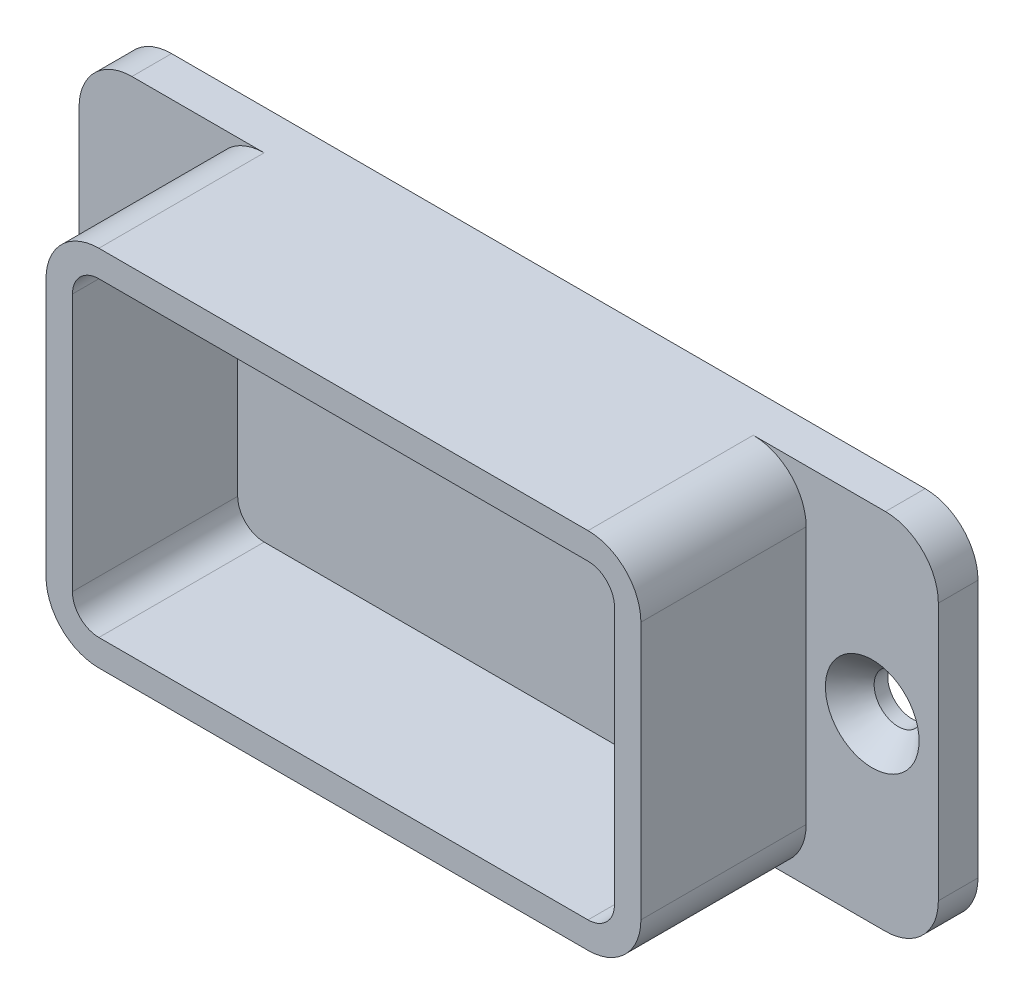
ISO-10303-21;
HEADER;
FILE_DESCRIPTION(('STEP AP214'),'2;1');
FILE_NAME('part.step','',(''),(''),'','','');
FILE_SCHEMA(('AUTOMOTIVE_DESIGN { 1 0 10303 214 1 1 1 1 }'));
ENDSEC;
DATA;
#1=APPLICATION_CONTEXT('core data for automotive mechanical design processes');
#2=APPLICATION_PROTOCOL_DEFINITION('international standard','automotive_design',2000,#1);
#3=PRODUCT_CONTEXT('',#1,'mechanical');
#4=PRODUCT('Part','Part','',(#3));
#5=PRODUCT_RELATED_PRODUCT_CATEGORY('part','',(#4));
#6=PRODUCT_DEFINITION_FORMATION('','',#4);
#7=PRODUCT_DEFINITION_CONTEXT('part definition',#1,'design');
#8=PRODUCT_DEFINITION('design','',#6,#7);
#9=PRODUCT_DEFINITION_SHAPE('','',#8);
#10=(LENGTH_UNIT() NAMED_UNIT(*) SI_UNIT(.MILLI.,.METRE.));
#11=(NAMED_UNIT(*) PLANE_ANGLE_UNIT() SI_UNIT($,.RADIAN.));
#12=(NAMED_UNIT(*) SI_UNIT($,.STERADIAN.) SOLID_ANGLE_UNIT());
#13=UNCERTAINTY_MEASURE_WITH_UNIT(LENGTH_MEASURE(1.E-05),#10,'distance_accuracy_value','');
#14=(GEOMETRIC_REPRESENTATION_CONTEXT(3) GLOBAL_UNCERTAINTY_ASSIGNED_CONTEXT((#13)) GLOBAL_UNIT_ASSIGNED_CONTEXT((#10,
#11,#12)) REPRESENTATION_CONTEXT('',''));
#15=CARTESIAN_POINT('',(0.,0.,0.));
#16=DIRECTION('',(0.,0.,1.));
#17=DIRECTION('',(1.,0.,0.));
#18=AXIS2_PLACEMENT_3D('',#15,#16,#17);
#19=CARTESIAN_POINT('',(-22.5,-13.75,65.7375577743225));
#20=DIRECTION('',(0.,1.,0.));
#21=DIRECTION('',(0.,0.,1.));
#22=AXIS2_PLACEMENT_3D('',#19,#20,#21);
#23=PLANE('',#22);
#24=DIRECTION('',(1.,0.,0.));
#25=VECTOR('',#24,1.);
#26=CARTESIAN_POINT('',(-32.5,-13.75,0.5));
#27=LINE('',#26,#25);
#28=CARTESIAN_POINT('',(18.5,-13.75,0.5));
#29=VERTEX_POINT('',#28);
#30=CARTESIAN_POINT('',(28.5,-13.75,0.5));
#31=VERTEX_POINT('',#30);
#32=EDGE_CURVE('E50',#29,#31,#27,.T.);
#33=ORIENTED_EDGE('',*,*,#32,.F.);
#34=DIRECTION('',(0.,0.,-1.));
#35=VECTOR('',#34,1.);
#36=CARTESIAN_POINT('',(18.5,-13.75,65.7375577743225));
#37=LINE('',#36,#35);
#38=CARTESIAN_POINT('',(18.5,-13.75,13.));
#39=VERTEX_POINT('',#38);
#40=EDGE_CURVE('E315',#29,#39,#37,.F.);
#41=ORIENTED_EDGE('',*,*,#40,.T.);
#42=DIRECTION('',(1.,0.,0.));
#43=VECTOR('',#42,1.);
#44=CARTESIAN_POINT('',(-22.5,-13.75,13.));
#45=LINE('',#44,#43);
#46=CARTESIAN_POINT('',(-18.5,-13.75,13.));
#47=VERTEX_POINT('',#46);
#48=EDGE_CURVE('E332',#47,#39,#45,.T.);
#49=ORIENTED_EDGE('',*,*,#48,.F.);
#50=DIRECTION('',(0.,0.,-1.));
#51=VECTOR('',#50,1.);
#52=CARTESIAN_POINT('',(-18.5,-13.75,65.7375577743225));
#53=LINE('',#52,#51);
#54=CARTESIAN_POINT('',(-18.5,-13.75,0.5));
#55=VERTEX_POINT('',#54);
#56=EDGE_CURVE('E312',#47,#55,#53,.T.);
#57=ORIENTED_EDGE('',*,*,#56,.T.);
#58=CARTESIAN_POINT('',(-28.5,-13.75,0.5));
#59=VERTEX_POINT('',#58);
#60=EDGE_CURVE('E57',#59,#55,#27,.T.);
#61=ORIENTED_EDGE('',*,*,#60,.F.);
#62=DIRECTION('',(0.,0.,-1.));
#63=VECTOR('',#62,1.);
#64=CARTESIAN_POINT('',(-28.5,-13.75,65.7375577743225));
#65=LINE('',#64,#63);
#66=CARTESIAN_POINT('',(-28.5,-13.75,-2.5));
#67=VERTEX_POINT('',#66);
#68=EDGE_CURVE('E205',#59,#67,#65,.T.);
#69=ORIENTED_EDGE('',*,*,#68,.T.);
#70=DIRECTION('',(1.,0.,0.));
#71=VECTOR('',#70,1.);
#72=CARTESIAN_POINT('',(-22.5,-13.75,-2.5));
#73=LINE('',#72,#71);
#74=CARTESIAN_POINT('',(28.5,-13.75,-2.5));
#75=VERTEX_POINT('',#74);
#76=EDGE_CURVE('E356',#67,#75,#73,.T.);
#77=ORIENTED_EDGE('',*,*,#76,.T.);
#78=DIRECTION('',(0.,0.,-1.));
#79=VECTOR('',#78,1.);
#80=CARTESIAN_POINT('',(28.5,-13.75,65.7375577743225));
#81=LINE('',#80,#79);
#82=EDGE_CURVE('E244',#75,#31,#81,.F.);
#83=ORIENTED_EDGE('',*,*,#82,.T.);
#84=EDGE_LOOP('',(#33,#41,#49,#57,#61,#69,#77,#83));
#85=FACE_BOUND('',#84,.T.);
#86=ADVANCED_FACE('F35',(#85),#23,.F.);
#87=CARTESIAN_POINT('',(-22.5,-13.75,65.7375577743225));
#88=DIRECTION('',(1.,0.,0.));
#89=DIRECTION('',(0.,0.,-1.));
#90=AXIS2_PLACEMENT_3D('',#87,#88,#89);
#91=PLANE('',#90);
#92=DIRECTION('',(0.,-1.,0.));
#93=VECTOR('',#92,1.);
#94=CARTESIAN_POINT('',(-22.5,-13.75,13.));
#95=LINE('',#94,#93);
#96=CARTESIAN_POINT('',(-22.5,9.75,13.));
#97=VERTEX_POINT('',#96);
#98=CARTESIAN_POINT('',(-22.5,-9.75,13.));
#99=VERTEX_POINT('',#98);
#100=EDGE_CURVE('E341',#97,#99,#95,.T.);
#101=ORIENTED_EDGE('',*,*,#100,.F.);
#102=DIRECTION('',(0.,0.,-1.));
#103=VECTOR('',#102,1.);
#104=CARTESIAN_POINT('',(-22.5,9.75,65.7375577743225));
#105=LINE('',#104,#103);
#106=CARTESIAN_POINT('',(-22.5,9.75,0.5));
#107=VERTEX_POINT('',#106);
#108=EDGE_CURVE('E293',#97,#107,#105,.T.);
#109=ORIENTED_EDGE('',*,*,#108,.T.);
#110=DIRECTION('',(0.,-1.,0.));
#111=VECTOR('',#110,1.);
#112=CARTESIAN_POINT('',(-22.5,-13.75,0.5));
#113=LINE('',#112,#111);
#114=CARTESIAN_POINT('',(-22.5,-9.75,0.5));
#115=VERTEX_POINT('',#114);
#116=EDGE_CURVE('E397',#107,#115,#113,.T.);
#117=ORIENTED_EDGE('',*,*,#116,.T.);
#118=DIRECTION('',(0.,0.,-1.));
#119=VECTOR('',#118,1.);
#120=CARTESIAN_POINT('',(-22.5,-9.75,65.7375577743225));
#121=LINE('',#120,#119);
#122=EDGE_CURVE('E291',#115,#99,#121,.F.);
#123=ORIENTED_EDGE('',*,*,#122,.T.);
#124=EDGE_LOOP('',(#101,#109,#117,#123));
#125=FACE_BOUND('',#124,.T.);
#126=ADVANCED_FACE('F468',(#125),#91,.F.);
#127=CARTESIAN_POINT('',(-22.5,13.75,65.7375577743225));
#128=DIRECTION('',(0.,-1.,0.));
#129=DIRECTION('',(0.,0.,-1.));
#130=AXIS2_PLACEMENT_3D('',#127,#128,#129);
#131=PLANE('',#130);
#132=DIRECTION('',(-1.,0.,0.));
#133=VECTOR('',#132,1.);
#134=CARTESIAN_POINT('',(-32.5,13.75,0.5));
#135=LINE('',#134,#133);
#136=CARTESIAN_POINT('',(-18.5,13.75,0.5));
#137=VERTEX_POINT('',#136);
#138=CARTESIAN_POINT('',(-28.5,13.75,0.5));
#139=VERTEX_POINT('',#138);
#140=EDGE_CURVE('E219',#137,#139,#135,.T.);
#141=ORIENTED_EDGE('',*,*,#140,.F.);
#142=DIRECTION('',(0.,0.,-1.));
#143=VECTOR('',#142,1.);
#144=CARTESIAN_POINT('',(-18.5,13.75,65.7375577743225));
#145=LINE('',#144,#143);
#146=CARTESIAN_POINT('',(-18.5,13.75,13.));
#147=VERTEX_POINT('',#146);
#148=EDGE_CURVE('E297',#137,#147,#145,.F.);
#149=ORIENTED_EDGE('',*,*,#148,.T.);
#150=DIRECTION('',(-1.,0.,0.));
#151=VECTOR('',#150,1.);
#152=CARTESIAN_POINT('',(-22.5,13.75,13.));
#153=LINE('',#152,#151);
#154=CARTESIAN_POINT('',(18.5,13.75,13.));
#155=VERTEX_POINT('',#154);
#156=EDGE_CURVE('E344',#155,#147,#153,.T.);
#157=ORIENTED_EDGE('',*,*,#156,.F.);
#158=DIRECTION('',(0.,0.,-1.));
#159=VECTOR('',#158,1.);
#160=CARTESIAN_POINT('',(18.5,13.75,65.7375577743225));
#161=LINE('',#160,#159);
#162=CARTESIAN_POINT('',(18.5,13.75,0.5));
#163=VERTEX_POINT('',#162);
#164=EDGE_CURVE('E217',#155,#163,#161,.T.);
#165=ORIENTED_EDGE('',*,*,#164,.T.);
#166=CARTESIAN_POINT('',(28.5,13.75,0.5));
#167=VERTEX_POINT('',#166);
#168=EDGE_CURVE('E198',#167,#163,#135,.T.);
#169=ORIENTED_EDGE('',*,*,#168,.F.);
#170=DIRECTION('',(0.,0.,-1.));
#171=VECTOR('',#170,1.);
#172=CARTESIAN_POINT('',(28.5,13.75,65.7375577743225));
#173=LINE('',#172,#171);
#174=CARTESIAN_POINT('',(28.5,13.75,-2.5));
#175=VERTEX_POINT('',#174);
#176=EDGE_CURVE('E213',#167,#175,#173,.T.);
#177=ORIENTED_EDGE('',*,*,#176,.T.);
#178=DIRECTION('',(-1.,0.,0.));
#179=VECTOR('',#178,1.);
#180=CARTESIAN_POINT('',(-22.5,13.75,-2.5));
#181=LINE('',#180,#179);
#182=CARTESIAN_POINT('',(-28.5,13.75,-2.5));
#183=VERTEX_POINT('',#182);
#184=EDGE_CURVE('E354',#175,#183,#181,.T.);
#185=ORIENTED_EDGE('',*,*,#184,.T.);
#186=DIRECTION('',(0.,0.,-1.));
#187=VECTOR('',#186,1.);
#188=CARTESIAN_POINT('',(-28.5,13.75,65.7375577743225));
#189=LINE('',#188,#187);
#190=EDGE_CURVE('E224',#183,#139,#189,.F.);
#191=ORIENTED_EDGE('',*,*,#190,.T.);
#192=EDGE_LOOP('',(#141,#149,#157,#165,#169,#177,#185,#191));
#193=FACE_BOUND('',#192,.T.);
#194=ADVANCED_FACE('F211',(#193),#131,.F.);
#195=CARTESIAN_POINT('',(22.5,-13.75,65.7375577743225));
#196=DIRECTION('',(-1.,0.,0.));
#197=DIRECTION('',(0.,0.,1.));
#198=AXIS2_PLACEMENT_3D('',#195,#196,#197);
#199=PLANE('',#198);
#200=DIRECTION('',(0.,1.,0.));
#201=VECTOR('',#200,1.);
#202=CARTESIAN_POINT('',(22.5,-13.75,0.5));
#203=LINE('',#202,#201);
#204=CARTESIAN_POINT('',(22.5,-9.75,0.5));
#205=VERTEX_POINT('',#204);
#206=CARTESIAN_POINT('',(22.5,9.75,0.5));
#207=VERTEX_POINT('',#206);
#208=EDGE_CURVE('E325',#205,#207,#203,.T.);
#209=ORIENTED_EDGE('',*,*,#208,.T.);
#210=DIRECTION('',(0.,0.,-1.));
#211=VECTOR('',#210,1.);
#212=CARTESIAN_POINT('',(22.5,9.75,65.7375577743225));
#213=LINE('',#212,#211);
#214=CARTESIAN_POINT('',(22.5,9.75,13.));
#215=VERTEX_POINT('',#214);
#216=EDGE_CURVE('E310',#207,#215,#213,.F.);
#217=ORIENTED_EDGE('',*,*,#216,.T.);
#218=DIRECTION('',(0.,1.,0.));
#219=VECTOR('',#218,1.);
#220=CARTESIAN_POINT('',(22.5,-13.75,13.));
#221=LINE('',#220,#219);
#222=CARTESIAN_POINT('',(22.5,-9.75,13.));
#223=VERTEX_POINT('',#222);
#224=EDGE_CURVE('E352',#223,#215,#221,.T.);
#225=ORIENTED_EDGE('',*,*,#224,.F.);
#226=DIRECTION('',(0.,0.,-1.));
#227=VECTOR('',#226,1.);
#228=CARTESIAN_POINT('',(22.5,-9.75,65.7375577743225));
#229=LINE('',#228,#227);
#230=EDGE_CURVE('E307',#223,#205,#229,.T.);
#231=ORIENTED_EDGE('',*,*,#230,.T.);
#232=EDGE_LOOP('',(#209,#217,#225,#231));
#233=FACE_BOUND('',#232,.T.);
#234=ADVANCED_FACE('F478',(#233),#199,.F.);
#235=CARTESIAN_POINT('',(0.,0.,-2.5));
#236=DIRECTION('',(0.,0.,-1.));
#237=DIRECTION('',(-1.,0.,0.));
#238=AXIS2_PLACEMENT_3D('',#235,#236,#237);
#239=PLANE('',#238);
#240=CARTESIAN_POINT('',(-27.5,0.,-2.5));
#241=DIRECTION('',(0.,0.,1.));
#242=DIRECTION('',(1.,0.,0.));
#243=AXIS2_PLACEMENT_3D('',#240,#241,#242);
#244=CIRCLE('',#243,1.8288);
#245=CARTESIAN_POINT('',(-25.6712,0.,-2.5));
#246=VERTEX_POINT('',#245);
#247=EDGE_CURVE('E428',#246,#246,#244,.T.);
#248=ORIENTED_EDGE('',*,*,#247,.T.);
#249=EDGE_LOOP('',(#248));
#250=FACE_BOUND('',#249,.T.);
#251=CARTESIAN_POINT('',(27.5,0.,-2.5));
#252=DIRECTION('',(0.,0.,1.));
#253=DIRECTION('',(1.,0.,0.));
#254=AXIS2_PLACEMENT_3D('',#251,#252,#253);
#255=CIRCLE('',#254,1.8288);
#256=CARTESIAN_POINT('',(29.3288,0.,-2.5));
#257=VERTEX_POINT('',#256);
#258=EDGE_CURVE('E414',#257,#257,#255,.T.);
#259=ORIENTED_EDGE('',*,*,#258,.T.);
#260=EDGE_LOOP('',(#259));
#261=FACE_BOUND('',#260,.T.);
#262=ORIENTED_EDGE('',*,*,#184,.F.);
#263=CARTESIAN_POINT('',(28.5,9.75,-2.5));
#264=DIRECTION('',(0.,0.,-1.));
#265=DIRECTION('',(-1.,0.,0.));
#266=AXIS2_PLACEMENT_3D('',#263,#264,#265);
#267=CIRCLE('',#266,4.);
#268=CARTESIAN_POINT('',(32.5,9.75,-2.5));
#269=VERTEX_POINT('',#268);
#270=EDGE_CURVE('E222',#175,#269,#267,.T.);
#271=ORIENTED_EDGE('',*,*,#270,.T.);
#272=DIRECTION('',(0.,1.,0.));
#273=VECTOR('',#272,1.);
#274=CARTESIAN_POINT('',(32.5,13.75,-2.5));
#275=LINE('',#274,#273);
#276=CARTESIAN_POINT('',(32.5,-9.75,-2.5));
#277=VERTEX_POINT('',#276);
#278=EDGE_CURVE('E408',#277,#269,#275,.T.);
#279=ORIENTED_EDGE('',*,*,#278,.F.);
#280=CARTESIAN_POINT('',(28.5,-9.75,-2.5));
#281=DIRECTION('',(0.,0.,-1.));
#282=DIRECTION('',(-1.,0.,0.));
#283=AXIS2_PLACEMENT_3D('',#280,#281,#282);
#284=CIRCLE('',#283,4.);
#285=EDGE_CURVE('E233',#277,#75,#284,.T.);
#286=ORIENTED_EDGE('',*,*,#285,.T.);
#287=ORIENTED_EDGE('',*,*,#76,.F.);
#288=CARTESIAN_POINT('',(-28.5,-9.75,-2.5));
#289=DIRECTION('',(0.,0.,-1.));
#290=DIRECTION('',(-1.,0.,0.));
#291=AXIS2_PLACEMENT_3D('',#288,#289,#290);
#292=CIRCLE('',#291,4.);
#293=CARTESIAN_POINT('',(-32.5,-9.75,-2.5));
#294=VERTEX_POINT('',#293);
#295=EDGE_CURVE('E223',#67,#294,#292,.T.);
#296=ORIENTED_EDGE('',*,*,#295,.T.);
#297=DIRECTION('',(0.,-1.,0.));
#298=VECTOR('',#297,1.);
#299=CARTESIAN_POINT('',(-32.5,13.75,-2.5));
#300=LINE('',#299,#298);
#301=CARTESIAN_POINT('',(-32.5,9.75,-2.5));
#302=VERTEX_POINT('',#301);
#303=EDGE_CURVE('E412',#302,#294,#300,.T.);
#304=ORIENTED_EDGE('',*,*,#303,.F.);
#305=CARTESIAN_POINT('',(-28.5,9.75,-2.5));
#306=DIRECTION('',(0.,0.,-1.));
#307=DIRECTION('',(-1.,0.,0.));
#308=AXIS2_PLACEMENT_3D('',#305,#306,#307);
#309=CIRCLE('',#308,4.);
#310=EDGE_CURVE('E226',#302,#183,#309,.T.);
#311=ORIENTED_EDGE('',*,*,#310,.T.);
#312=EDGE_LOOP('',(#262,#271,#279,#286,#287,#296,#304,#311));
#313=FACE_BOUND('',#312,.T.);
#314=ADVANCED_FACE('F457',(#250,#261,#313),#239,.T.);
#315=CARTESIAN_POINT('',(-20.5,-11.75,65.7375577743225));
#316=DIRECTION('',(0.,1.,0.));
#317=DIRECTION('',(0.,0.,1.));
#318=AXIS2_PLACEMENT_3D('',#315,#316,#317);
#319=PLANE('',#318);
#320=DIRECTION('',(1.,0.,0.));
#321=VECTOR('',#320,1.);
#322=CARTESIAN_POINT('',(-20.5,-11.75,0.5));
#323=LINE('',#322,#321);
#324=CARTESIAN_POINT('',(-18.5,-11.75,0.5));
#325=VERTEX_POINT('',#324);
#326=CARTESIAN_POINT('',(18.5,-11.75,0.5));
#327=VERTEX_POINT('',#326);
#328=EDGE_CURVE('E385',#325,#327,#323,.T.);
#329=ORIENTED_EDGE('',*,*,#328,.F.);
#330=DIRECTION('',(0.,0.,-1.));
#331=VECTOR('',#330,1.);
#332=CARTESIAN_POINT('',(-18.5,-11.75,13.));
#333=LINE('',#332,#331);
#334=CARTESIAN_POINT('',(-18.5,-11.75,13.));
#335=VERTEX_POINT('',#334);
#336=EDGE_CURVE('E271',#325,#335,#333,.F.);
#337=ORIENTED_EDGE('',*,*,#336,.T.);
#338=DIRECTION('',(1.,0.,0.));
#339=VECTOR('',#338,1.);
#340=CARTESIAN_POINT('',(-20.5,-11.75,13.));
#341=LINE('',#340,#339);
#342=CARTESIAN_POINT('',(18.5,-11.75,13.));
#343=VERTEX_POINT('',#342);
#344=EDGE_CURVE('E359',#335,#343,#341,.T.);
#345=ORIENTED_EDGE('',*,*,#344,.T.);
#346=DIRECTION('',(0.,0.,-1.));
#347=VECTOR('',#346,1.);
#348=CARTESIAN_POINT('',(18.5,-11.75,0.5));
#349=LINE('',#348,#347);
#350=EDGE_CURVE('E268',#343,#327,#349,.T.);
#351=ORIENTED_EDGE('',*,*,#350,.T.);
#352=EDGE_LOOP('',(#329,#337,#345,#351));
#353=FACE_BOUND('',#352,.T.);
#354=ADVANCED_FACE('F383',(#353),#319,.T.);
#355=CARTESIAN_POINT('',(-20.5,-11.75,65.7375577743225));
#356=DIRECTION('',(1.,0.,0.));
#357=DIRECTION('',(0.,0.,-1.));
#358=AXIS2_PLACEMENT_3D('',#355,#356,#357);
#359=PLANE('',#358);
#360=DIRECTION('',(0.,-1.,0.));
#361=VECTOR('',#360,1.);
#362=CARTESIAN_POINT('',(-20.5,-11.75,13.));
#363=LINE('',#362,#361);
#364=CARTESIAN_POINT('',(-20.5,9.75,13.));
#365=VERTEX_POINT('',#364);
#366=CARTESIAN_POINT('',(-20.5,-9.75,13.));
#367=VERTEX_POINT('',#366);
#368=EDGE_CURVE('E391',#365,#367,#363,.T.);
#369=ORIENTED_EDGE('',*,*,#368,.T.);
#370=DIRECTION('',(0.,0.,-1.));
#371=VECTOR('',#370,1.);
#372=CARTESIAN_POINT('',(-20.5,-9.75,0.5));
#373=LINE('',#372,#371);
#374=CARTESIAN_POINT('',(-20.5,-9.75,0.5));
#375=VERTEX_POINT('',#374);
#376=EDGE_CURVE('E257',#367,#375,#373,.T.);
#377=ORIENTED_EDGE('',*,*,#376,.T.);
#378=DIRECTION('',(0.,-1.,0.));
#379=VECTOR('',#378,1.);
#380=CARTESIAN_POINT('',(-20.5,-11.75,0.5));
#381=LINE('',#380,#379);
#382=CARTESIAN_POINT('',(-20.5,9.75,0.5));
#383=VERTEX_POINT('',#382);
#384=EDGE_CURVE('E405',#383,#375,#381,.T.);
#385=ORIENTED_EDGE('',*,*,#384,.F.);
#386=DIRECTION('',(0.,0.,-1.));
#387=VECTOR('',#386,1.);
#388=CARTESIAN_POINT('',(-20.5,9.75,13.));
#389=LINE('',#388,#387);
#390=EDGE_CURVE('E255',#383,#365,#389,.F.);
#391=ORIENTED_EDGE('',*,*,#390,.T.);
#392=EDGE_LOOP('',(#369,#377,#385,#391));
#393=FACE_BOUND('',#392,.T.);
#394=ADVANCED_FACE('F394',(#393),#359,.T.);
#395=CARTESIAN_POINT('',(-20.5,11.75,65.7375577743225));
#396=DIRECTION('',(0.,-1.,0.));
#397=DIRECTION('',(0.,0.,-1.));
#398=AXIS2_PLACEMENT_3D('',#395,#396,#397);
#399=PLANE('',#398);
#400=DIRECTION('',(-1.,0.,0.));
#401=VECTOR('',#400,1.);
#402=CARTESIAN_POINT('',(-20.5,11.75,0.5));
#403=LINE('',#402,#401);
#404=CARTESIAN_POINT('',(18.5,11.75,0.5));
#405=VERTEX_POINT('',#404);
#406=CARTESIAN_POINT('',(-18.5,11.75,0.5));
#407=VERTEX_POINT('',#406);
#408=EDGE_CURVE('E218',#405,#407,#403,.T.);
#409=ORIENTED_EDGE('',*,*,#408,.F.);
#410=DIRECTION('',(0.,0.,-1.));
#411=VECTOR('',#410,1.);
#412=CARTESIAN_POINT('',(18.5,11.75,13.));
#413=LINE('',#412,#411);
#414=CARTESIAN_POINT('',(18.5,11.75,13.));
#415=VERTEX_POINT('',#414);
#416=EDGE_CURVE('E281',#405,#415,#413,.F.);
#417=ORIENTED_EDGE('',*,*,#416,.T.);
#418=DIRECTION('',(-1.,0.,0.));
#419=VECTOR('',#418,1.);
#420=CARTESIAN_POINT('',(-20.5,11.75,13.));
#421=LINE('',#420,#419);
#422=CARTESIAN_POINT('',(-18.5,11.75,13.));
#423=VERTEX_POINT('',#422);
#424=EDGE_CURVE('E347',#415,#423,#421,.T.);
#425=ORIENTED_EDGE('',*,*,#424,.T.);
#426=DIRECTION('',(0.,0.,-1.));
#427=VECTOR('',#426,1.);
#428=CARTESIAN_POINT('',(-18.5,11.75,0.5));
#429=LINE('',#428,#427);
#430=EDGE_CURVE('E278',#423,#407,#429,.T.);
#431=ORIENTED_EDGE('',*,*,#430,.T.);
#432=EDGE_LOOP('',(#409,#417,#425,#431));
#433=FACE_BOUND('',#432,.T.);
#434=ADVANCED_FACE('F498',(#433),#399,.T.);
#435=CARTESIAN_POINT('',(20.5,-11.75,65.7375577743225));
#436=DIRECTION('',(-1.,0.,0.));
#437=DIRECTION('',(0.,0.,1.));
#438=AXIS2_PLACEMENT_3D('',#435,#436,#437);
#439=PLANE('',#438);
#440=DIRECTION('',(0.,1.,0.));
#441=VECTOR('',#440,1.);
#442=CARTESIAN_POINT('',(20.5,-11.75,0.5));
#443=LINE('',#442,#441);
#444=CARTESIAN_POINT('',(20.5,-9.75,0.5));
#445=VERTEX_POINT('',#444);
#446=CARTESIAN_POINT('',(20.5,9.75,0.5));
#447=VERTEX_POINT('',#446);
#448=EDGE_CURVE('E228',#445,#447,#443,.T.);
#449=ORIENTED_EDGE('',*,*,#448,.F.);
#450=DIRECTION('',(0.,0.,-1.));
#451=VECTOR('',#450,1.);
#452=CARTESIAN_POINT('',(20.5,-9.75,13.));
#453=LINE('',#452,#451);
#454=CARTESIAN_POINT('',(20.5,-9.75,13.));
#455=VERTEX_POINT('',#454);
#456=EDGE_CURVE('E276',#445,#455,#453,.F.);
#457=ORIENTED_EDGE('',*,*,#456,.T.);
#458=DIRECTION('',(0.,1.,0.));
#459=VECTOR('',#458,1.);
#460=CARTESIAN_POINT('',(20.5,-11.75,13.));
#461=LINE('',#460,#459);
#462=CARTESIAN_POINT('',(20.5,9.75,13.));
#463=VERTEX_POINT('',#462);
#464=EDGE_CURVE('E342',#455,#463,#461,.T.);
#465=ORIENTED_EDGE('',*,*,#464,.T.);
#466=DIRECTION('',(0.,0.,-1.));
#467=VECTOR('',#466,1.);
#468=CARTESIAN_POINT('',(20.5,9.75,0.5));
#469=LINE('',#468,#467);
#470=EDGE_CURVE('E273',#463,#447,#469,.T.);
#471=ORIENTED_EDGE('',*,*,#470,.T.);
#472=EDGE_LOOP('',(#449,#457,#465,#471));
#473=FACE_BOUND('',#472,.T.);
#474=ADVANCED_FACE('F371',(#473),#439,.T.);
#475=CARTESIAN_POINT('',(0.,0.,13.));
#476=DIRECTION('',(0.,0.,1.));
#477=DIRECTION('',(1.,0.,0.));
#478=AXIS2_PLACEMENT_3D('',#475,#476,#477);
#479=PLANE('',#478);
#480=ORIENTED_EDGE('',*,*,#464,.F.);
#481=CARTESIAN_POINT('',(18.5,-9.75,13.));
#482=DIRECTION('',(0.,0.,1.));
#483=DIRECTION('',(1.,0.,0.));
#484=AXIS2_PLACEMENT_3D('',#481,#482,#483);
#485=CIRCLE('',#484,2.);
#486=EDGE_CURVE('E285',#455,#343,#485,.F.);
#487=ORIENTED_EDGE('',*,*,#486,.T.);
#488=ORIENTED_EDGE('',*,*,#344,.F.);
#489=CARTESIAN_POINT('',(-18.5,-9.75,13.));
#490=DIRECTION('',(0.,0.,1.));
#491=DIRECTION('',(1.,0.,0.));
#492=AXIS2_PLACEMENT_3D('',#489,#490,#491);
#493=CIRCLE('',#492,2.);
#494=EDGE_CURVE('E283',#335,#367,#493,.F.);
#495=ORIENTED_EDGE('',*,*,#494,.T.);
#496=ORIENTED_EDGE('',*,*,#368,.F.);
#497=CARTESIAN_POINT('',(-18.5,9.75,13.));
#498=DIRECTION('',(0.,0.,1.));
#499=DIRECTION('',(1.,0.,0.));
#500=AXIS2_PLACEMENT_3D('',#497,#498,#499);
#501=CIRCLE('',#500,2.);
#502=EDGE_CURVE('E289',#365,#423,#501,.F.);
#503=ORIENTED_EDGE('',*,*,#502,.T.);
#504=ORIENTED_EDGE('',*,*,#424,.F.);
#505=CARTESIAN_POINT('',(18.5,9.75,13.));
#506=DIRECTION('',(0.,0.,1.));
#507=DIRECTION('',(1.,0.,0.));
#508=AXIS2_PLACEMENT_3D('',#505,#506,#507);
#509=CIRCLE('',#508,2.);
#510=EDGE_CURVE('E287',#415,#463,#509,.F.);
#511=ORIENTED_EDGE('',*,*,#510,.T.);
#512=EDGE_LOOP('',(#480,#487,#488,#495,#496,#503,#504,#511));
#513=FACE_BOUND('',#512,.T.);
#514=ORIENTED_EDGE('',*,*,#156,.T.);
#515=CARTESIAN_POINT('',(-18.5,9.75,13.));
#516=DIRECTION('',(0.,0.,1.));
#517=DIRECTION('',(1.,0.,0.));
#518=AXIS2_PLACEMENT_3D('',#515,#516,#517);
#519=CIRCLE('',#518,4.);
#520=EDGE_CURVE('E305',#147,#97,#519,.T.);
#521=ORIENTED_EDGE('',*,*,#520,.T.);
#522=ORIENTED_EDGE('',*,*,#100,.T.);
#523=CARTESIAN_POINT('',(-18.5,-9.75,13.));
#524=DIRECTION('',(0.,0.,1.));
#525=DIRECTION('',(1.,0.,0.));
#526=AXIS2_PLACEMENT_3D('',#523,#524,#525);
#527=CIRCLE('',#526,4.);
#528=EDGE_CURVE('E299',#99,#47,#527,.T.);
#529=ORIENTED_EDGE('',*,*,#528,.T.);
#530=ORIENTED_EDGE('',*,*,#48,.T.);
#531=CARTESIAN_POINT('',(18.5,-9.75,13.));
#532=DIRECTION('',(0.,0.,1.));
#533=DIRECTION('',(1.,0.,0.));
#534=AXIS2_PLACEMENT_3D('',#531,#532,#533);
#535=CIRCLE('',#534,4.);
#536=EDGE_CURVE('E301',#39,#223,#535,.T.);
#537=ORIENTED_EDGE('',*,*,#536,.T.);
#538=ORIENTED_EDGE('',*,*,#224,.T.);
#539=CARTESIAN_POINT('',(18.5,9.75,13.));
#540=DIRECTION('',(0.,0.,1.));
#541=DIRECTION('',(1.,0.,0.));
#542=AXIS2_PLACEMENT_3D('',#539,#540,#541);
#543=CIRCLE('',#542,4.);
#544=EDGE_CURVE('E303',#215,#155,#543,.T.);
#545=ORIENTED_EDGE('',*,*,#544,.T.);
#546=EDGE_LOOP('',(#514,#521,#522,#529,#530,#537,#538,#545));
#547=FACE_BOUND('',#546,.T.);
#548=ADVANCED_FACE('F336',(#513,#547),#479,.T.);
#549=CARTESIAN_POINT('',(0.,0.,0.5));
#550=DIRECTION('',(0.,0.,1.));
#551=DIRECTION('',(1.,0.,0.));
#552=AXIS2_PLACEMENT_3D('',#549,#550,#551);
#553=PLANE('',#552);
#554=ORIENTED_EDGE('',*,*,#384,.T.);
#555=CARTESIAN_POINT('',(-18.5,-9.75,0.5));
#556=DIRECTION('',(0.,0.,1.));
#557=DIRECTION('',(1.,0.,0.));
#558=AXIS2_PLACEMENT_3D('',#555,#556,#557);
#559=CIRCLE('',#558,2.);
#560=EDGE_CURVE('E266',#375,#325,#559,.T.);
#561=ORIENTED_EDGE('',*,*,#560,.T.);
#562=ORIENTED_EDGE('',*,*,#328,.T.);
#563=CARTESIAN_POINT('',(18.5,-9.75,0.5));
#564=DIRECTION('',(0.,0.,1.));
#565=DIRECTION('',(1.,0.,0.));
#566=AXIS2_PLACEMENT_3D('',#563,#564,#565);
#567=CIRCLE('',#566,2.);
#568=EDGE_CURVE('E264',#327,#445,#567,.T.);
#569=ORIENTED_EDGE('',*,*,#568,.T.);
#570=ORIENTED_EDGE('',*,*,#448,.T.);
#571=CARTESIAN_POINT('',(18.5,9.75,0.5));
#572=DIRECTION('',(0.,0.,1.));
#573=DIRECTION('',(1.,0.,0.));
#574=AXIS2_PLACEMENT_3D('',#571,#572,#573);
#575=CIRCLE('',#574,2.);
#576=EDGE_CURVE('E262',#447,#405,#575,.T.);
#577=ORIENTED_EDGE('',*,*,#576,.T.);
#578=ORIENTED_EDGE('',*,*,#408,.T.);
#579=CARTESIAN_POINT('',(-18.5,9.75,0.5));
#580=DIRECTION('',(0.,0.,1.));
#581=DIRECTION('',(1.,0.,0.));
#582=AXIS2_PLACEMENT_3D('',#579,#580,#581);
#583=CIRCLE('',#582,2.);
#584=EDGE_CURVE('E260',#407,#383,#583,.T.);
#585=ORIENTED_EDGE('',*,*,#584,.T.);
#586=EDGE_LOOP('',(#554,#561,#562,#569,#570,#577,#578,#585));
#587=FACE_BOUND('',#586,.T.);
#588=ADVANCED_FACE('F365',(#587),#553,.T.);
#589=CARTESIAN_POINT('',(32.5,13.75,0.5));
#590=DIRECTION('',(-1.,0.,0.));
#591=DIRECTION('',(0.,0.,1.));
#592=AXIS2_PLACEMENT_3D('',#589,#590,#591);
#593=PLANE('',#592);
#594=ORIENTED_EDGE('',*,*,#278,.T.);
#595=DIRECTION('',(0.,0.,-1.));
#596=VECTOR('',#595,1.);
#597=CARTESIAN_POINT('',(32.5,9.75,0.5));
#598=LINE('',#597,#596);
#599=CARTESIAN_POINT('',(32.5,9.75,0.5));
#600=VERTEX_POINT('',#599);
#601=EDGE_CURVE('E239',#269,#600,#598,.F.);
#602=ORIENTED_EDGE('',*,*,#601,.T.);
#603=DIRECTION('',(0.,1.,0.));
#604=VECTOR('',#603,1.);
#605=CARTESIAN_POINT('',(32.5,13.75,0.5));
#606=LINE('',#605,#604);
#607=CARTESIAN_POINT('',(32.5,-9.75,0.5));
#608=VERTEX_POINT('',#607);
#609=EDGE_CURVE('E201',#608,#600,#606,.T.);
#610=ORIENTED_EDGE('',*,*,#609,.F.);
#611=DIRECTION('',(0.,0.,-1.));
#612=VECTOR('',#611,1.);
#613=CARTESIAN_POINT('',(32.5,-9.75,0.5));
#614=LINE('',#613,#612);
#615=EDGE_CURVE('E236',#608,#277,#614,.T.);
#616=ORIENTED_EDGE('',*,*,#615,.T.);
#617=EDGE_LOOP('',(#594,#602,#610,#616));
#618=FACE_BOUND('',#617,.T.);
#619=ADVANCED_FACE('F511',(#618),#593,.F.);
#620=CARTESIAN_POINT('',(27.5,0.,0.5));
#621=DIRECTION('',(0.,0.,1.));
#622=DIRECTION('',(1.,0.,0.));
#623=AXIS2_PLACEMENT_3D('',#620,#621,#622);
#624=CIRCLE('',#623,3.5433);
#625=CARTESIAN_POINT('',(31.0433,0.,0.5));
#626=VERTEX_POINT('',#625);
#627=EDGE_CURVE('E425',#626,#626,#624,.T.);
#628=ORIENTED_EDGE('',*,*,#627,.F.);
#629=EDGE_LOOP('',(#628));
#630=FACE_BOUND('',#629,.T.);
#631=ORIENTED_EDGE('',*,*,#609,.T.);
#632=CARTESIAN_POINT('',(28.5,9.75,0.5));
#633=DIRECTION('',(0.,0.,1.));
#634=DIRECTION('',(1.,0.,0.));
#635=AXIS2_PLACEMENT_3D('',#632,#633,#634);
#636=CIRCLE('',#635,4.);
#637=EDGE_CURVE('E195',#600,#167,#636,.T.);
#638=ORIENTED_EDGE('',*,*,#637,.T.);
#639=ORIENTED_EDGE('',*,*,#168,.T.);
#640=CARTESIAN_POINT('',(18.5,9.75,0.5));
#641=DIRECTION('',(0.,0.,1.));
#642=DIRECTION('',(1.,0.,0.));
#643=AXIS2_PLACEMENT_3D('',#640,#641,#642);
#644=CIRCLE('',#643,4.);
#645=EDGE_CURVE('E320',#163,#207,#644,.F.);
#646=ORIENTED_EDGE('',*,*,#645,.T.);
#647=ORIENTED_EDGE('',*,*,#208,.F.);
#648=CARTESIAN_POINT('',(18.5,-9.75,0.5));
#649=DIRECTION('',(0.,0.,1.));
#650=DIRECTION('',(1.,0.,0.));
#651=AXIS2_PLACEMENT_3D('',#648,#649,#650);
#652=CIRCLE('',#651,4.);
#653=EDGE_CURVE('E43',#205,#29,#652,.F.);
#654=ORIENTED_EDGE('',*,*,#653,.T.);
#655=ORIENTED_EDGE('',*,*,#32,.T.);
#656=CARTESIAN_POINT('',(28.5,-9.75,0.5));
#657=DIRECTION('',(0.,0.,1.));
#658=DIRECTION('',(1.,0.,0.));
#659=AXIS2_PLACEMENT_3D('',#656,#657,#658);
#660=CIRCLE('',#659,4.);
#661=EDGE_CURVE('E206',#31,#608,#660,.T.);
#662=ORIENTED_EDGE('',*,*,#661,.T.);
#663=EDGE_LOOP('',(#631,#638,#639,#646,#647,#654,#655,#662));
#664=FACE_BOUND('',#663,.T.);
#665=ADVANCED_FACE('F197',(#630,#664),#553,.T.);
#666=CARTESIAN_POINT('',(-27.5,0.,0.5));
#667=DIRECTION('',(0.,0.,1.));
#668=DIRECTION('',(1.,0.,0.));
#669=AXIS2_PLACEMENT_3D('',#666,#667,#668);
#670=CIRCLE('',#669,3.5433);
#671=CARTESIAN_POINT('',(-23.9567,0.,0.5));
#672=VERTEX_POINT('',#671);
#673=EDGE_CURVE('E434',#672,#672,#670,.T.);
#674=ORIENTED_EDGE('',*,*,#673,.F.);
#675=EDGE_LOOP('',(#674));
#676=FACE_BOUND('',#675,.T.);
#677=ORIENTED_EDGE('',*,*,#140,.T.);
#678=CARTESIAN_POINT('',(-28.5,9.75,0.5));
#679=DIRECTION('',(0.,0.,1.));
#680=DIRECTION('',(1.,0.,0.));
#681=AXIS2_PLACEMENT_3D('',#678,#679,#680);
#682=CIRCLE('',#681,4.);
#683=CARTESIAN_POINT('',(-32.5,9.75,0.5));
#684=VERTEX_POINT('',#683);
#685=EDGE_CURVE('E253',#139,#684,#682,.T.);
#686=ORIENTED_EDGE('',*,*,#685,.T.);
#687=DIRECTION('',(0.,-1.,0.));
#688=VECTOR('',#687,1.);
#689=CARTESIAN_POINT('',(-32.5,13.75,0.5));
#690=LINE('',#689,#688);
#691=CARTESIAN_POINT('',(-32.5,-9.75,0.5));
#692=VERTEX_POINT('',#691);
#693=EDGE_CURVE('E411',#684,#692,#690,.T.);
#694=ORIENTED_EDGE('',*,*,#693,.T.);
#695=CARTESIAN_POINT('',(-28.5,-9.75,0.5));
#696=DIRECTION('',(0.,0.,1.));
#697=DIRECTION('',(1.,0.,0.));
#698=AXIS2_PLACEMENT_3D('',#695,#696,#697);
#699=CIRCLE('',#698,4.);
#700=EDGE_CURVE('E251',#692,#59,#699,.T.);
#701=ORIENTED_EDGE('',*,*,#700,.T.);
#702=ORIENTED_EDGE('',*,*,#60,.T.);
#703=CARTESIAN_POINT('',(-18.5,-9.75,0.5));
#704=DIRECTION('',(0.,0.,1.));
#705=DIRECTION('',(1.,0.,0.));
#706=AXIS2_PLACEMENT_3D('',#703,#704,#705);
#707=CIRCLE('',#706,4.);
#708=EDGE_CURVE('E11',#55,#115,#707,.F.);
#709=ORIENTED_EDGE('',*,*,#708,.T.);
#710=ORIENTED_EDGE('',*,*,#116,.F.);
#711=CARTESIAN_POINT('',(-18.5,9.75,0.5));
#712=DIRECTION('',(0.,0.,1.));
#713=DIRECTION('',(1.,0.,0.));
#714=AXIS2_PLACEMENT_3D('',#711,#712,#713);
#715=CIRCLE('',#714,4.);
#716=EDGE_CURVE('E317',#107,#137,#715,.F.);
#717=ORIENTED_EDGE('',*,*,#716,.T.);
#718=EDGE_LOOP('',(#677,#686,#694,#701,#702,#709,#710,#717));
#719=FACE_BOUND('',#718,.T.);
#720=ADVANCED_FACE('F440',(#676,#719),#553,.T.);
#721=CARTESIAN_POINT('',(-32.5,13.75,0.5));
#722=DIRECTION('',(1.,0.,0.));
#723=DIRECTION('',(0.,1.,0.));
#724=AXIS2_PLACEMENT_3D('',#721,#722,#723);
#725=PLANE('',#724);
#726=ORIENTED_EDGE('',*,*,#693,.F.);
#727=DIRECTION('',(0.,0.,-1.));
#728=VECTOR('',#727,1.);
#729=CARTESIAN_POINT('',(-32.5,9.75,0.5));
#730=LINE('',#729,#728);
#731=EDGE_CURVE('E248',#684,#302,#730,.T.);
#732=ORIENTED_EDGE('',*,*,#731,.T.);
#733=ORIENTED_EDGE('',*,*,#303,.T.);
#734=DIRECTION('',(0.,0.,-1.));
#735=VECTOR('',#734,1.);
#736=CARTESIAN_POINT('',(-32.5,-9.75,0.5));
#737=LINE('',#736,#735);
#738=EDGE_CURVE('E246',#294,#692,#737,.F.);
#739=ORIENTED_EDGE('',*,*,#738,.T.);
#740=EDGE_LOOP('',(#726,#732,#733,#739));
#741=FACE_BOUND('',#740,.T.);
#742=ADVANCED_FACE('F442',(#741),#725,.F.);
#743=CARTESIAN_POINT('',(27.5,0.,0.5));
#744=DIRECTION('',(0.,0.,1.));
#745=DIRECTION('',(1.,0.,0.));
#746=AXIS2_PLACEMENT_3D('',#743,#744,#745);
#747=CYLINDRICAL_SURFACE('',#746,1.8288);
#748=ORIENTED_EDGE('',*,*,#258,.F.);
#749=EDGE_LOOP('',(#748));
#750=FACE_BOUND('',#749,.T.);
#751=CARTESIAN_POINT('',(27.5,0.,-1.47230663418042));
#752=DIRECTION('',(0.,0.,1.));
#753=DIRECTION('',(1.,0.,0.));
#754=AXIS2_PLACEMENT_3D('',#751,#752,#753);
#755=CIRCLE('',#754,1.8288);
#756=CARTESIAN_POINT('',(29.3288,0.,-1.47230663418042));
#757=VERTEX_POINT('',#756);
#758=EDGE_CURVE('E422',#757,#757,#755,.T.);
#759=ORIENTED_EDGE('',*,*,#758,.T.);
#760=EDGE_LOOP('',(#759));
#761=FACE_BOUND('',#760,.T.);
#762=ADVANCED_FACE('F510',(#750,#761),#747,.F.);
#763=CARTESIAN_POINT('',(27.5,0.,0.5));
#764=DIRECTION('',(0.,0.,1.));
#765=DIRECTION('',(1.,0.,0.));
#766=AXIS2_PLACEMENT_3D('',#763,#764,#765);
#767=CONICAL_SURFACE('',#766,3.5433,0.715584993317676);
#768=ORIENTED_EDGE('',*,*,#758,.F.);
#769=EDGE_LOOP('',(#768));
#770=FACE_BOUND('',#769,.T.);
#771=ORIENTED_EDGE('',*,*,#627,.T.);
#772=EDGE_LOOP('',(#771));
#773=FACE_BOUND('',#772,.T.);
#774=ADVANCED_FACE('F518',(#770,#773),#767,.F.);
#775=CARTESIAN_POINT('',(-27.5,0.,0.5));
#776=DIRECTION('',(0.,0.,1.));
#777=DIRECTION('',(1.,0.,0.));
#778=AXIS2_PLACEMENT_3D('',#775,#776,#777);
#779=CYLINDRICAL_SURFACE('',#778,1.8288);
#780=ORIENTED_EDGE('',*,*,#247,.F.);
#781=EDGE_LOOP('',(#780));
#782=FACE_BOUND('',#781,.T.);
#783=CARTESIAN_POINT('',(-27.5,0.,-1.47230663418042));
#784=DIRECTION('',(0.,0.,1.));
#785=DIRECTION('',(1.,0.,0.));
#786=AXIS2_PLACEMENT_3D('',#783,#784,#785);
#787=CIRCLE('',#786,1.8288);
#788=CARTESIAN_POINT('',(-25.6712,0.,-1.47230663418042));
#789=VERTEX_POINT('',#788);
#790=EDGE_CURVE('E431',#789,#789,#787,.T.);
#791=ORIENTED_EDGE('',*,*,#790,.T.);
#792=EDGE_LOOP('',(#791));
#793=FACE_BOUND('',#792,.T.);
#794=ADVANCED_FACE('F522',(#782,#793),#779,.F.);
#795=CARTESIAN_POINT('',(-27.5,0.,0.5));
#796=DIRECTION('',(0.,0.,1.));
#797=DIRECTION('',(1.,0.,0.));
#798=AXIS2_PLACEMENT_3D('',#795,#796,#797);
#799=CONICAL_SURFACE('',#798,3.5433,0.715584993317676);
#800=ORIENTED_EDGE('',*,*,#790,.F.);
#801=EDGE_LOOP('',(#800));
#802=FACE_BOUND('',#801,.T.);
#803=ORIENTED_EDGE('',*,*,#673,.T.);
#804=EDGE_LOOP('',(#803));
#805=FACE_BOUND('',#804,.T.);
#806=ADVANCED_FACE('F438',(#802,#805),#799,.F.);
#807=CARTESIAN_POINT('',(28.5,9.75,65.7375577743225));
#808=DIRECTION('',(0.,0.,-1.));
#809=DIRECTION('',(-1.,0.,0.));
#810=AXIS2_PLACEMENT_3D('',#807,#808,#809);
#811=CYLINDRICAL_SURFACE('',#810,4.);
#812=ORIENTED_EDGE('',*,*,#637,.F.);
#813=ORIENTED_EDGE('',*,*,#601,.F.);
#814=ORIENTED_EDGE('',*,*,#270,.F.);
#815=ORIENTED_EDGE('',*,*,#176,.F.);
#816=EDGE_LOOP('',(#812,#813,#814,#815));
#817=FACE_BOUND('',#816,.T.);
#818=ADVANCED_FACE('F221',(#817),#811,.T.);
#819=CARTESIAN_POINT('',(28.5,-9.75,0.5));
#820=DIRECTION('',(0.,0.,-1.));
#821=DIRECTION('',(-1.,0.,0.));
#822=AXIS2_PLACEMENT_3D('',#819,#820,#821);
#823=CYLINDRICAL_SURFACE('',#822,4.);
#824=ORIENTED_EDGE('',*,*,#661,.F.);
#825=ORIENTED_EDGE('',*,*,#82,.F.);
#826=ORIENTED_EDGE('',*,*,#285,.F.);
#827=ORIENTED_EDGE('',*,*,#615,.F.);
#828=EDGE_LOOP('',(#824,#825,#826,#827));
#829=FACE_BOUND('',#828,.T.);
#830=ADVANCED_FACE('F532',(#829),#823,.T.);
#831=CARTESIAN_POINT('',(-28.5,9.75,0.5));
#832=DIRECTION('',(0.,0.,-1.));
#833=DIRECTION('',(-1.,0.,0.));
#834=AXIS2_PLACEMENT_3D('',#831,#832,#833);
#835=CYLINDRICAL_SURFACE('',#834,4.);
#836=ORIENTED_EDGE('',*,*,#685,.F.);
#837=ORIENTED_EDGE('',*,*,#190,.F.);
#838=ORIENTED_EDGE('',*,*,#310,.F.);
#839=ORIENTED_EDGE('',*,*,#731,.F.);
#840=EDGE_LOOP('',(#836,#837,#838,#839));
#841=FACE_BOUND('',#840,.T.);
#842=ADVANCED_FACE('F452',(#841),#835,.T.);
#843=CARTESIAN_POINT('',(-28.5,-9.75,65.7375577743225));
#844=DIRECTION('',(0.,0.,-1.));
#845=DIRECTION('',(-1.,0.,0.));
#846=AXIS2_PLACEMENT_3D('',#843,#844,#845);
#847=CYLINDRICAL_SURFACE('',#846,4.);
#848=ORIENTED_EDGE('',*,*,#700,.F.);
#849=ORIENTED_EDGE('',*,*,#738,.F.);
#850=ORIENTED_EDGE('',*,*,#295,.F.);
#851=ORIENTED_EDGE('',*,*,#68,.F.);
#852=EDGE_LOOP('',(#848,#849,#850,#851));
#853=FACE_BOUND('',#852,.T.);
#854=ADVANCED_FACE('F462',(#853),#847,.T.);
#855=CARTESIAN_POINT('',(-18.5,-9.75,65.7375577743225));
#856=DIRECTION('',(0.,0.,1.));
#857=DIRECTION('',(1.,0.,0.));
#858=AXIS2_PLACEMENT_3D('',#855,#856,#857);
#859=CYLINDRICAL_SURFACE('',#858,2.);
#860=ORIENTED_EDGE('',*,*,#494,.F.);
#861=ORIENTED_EDGE('',*,*,#336,.F.);
#862=ORIENTED_EDGE('',*,*,#560,.F.);
#863=ORIENTED_EDGE('',*,*,#376,.F.);
#864=EDGE_LOOP('',(#860,#861,#862,#863));
#865=FACE_BOUND('',#864,.T.);
#866=ADVANCED_FACE('F387',(#865),#859,.F.);
#867=CARTESIAN_POINT('',(18.5,-9.75,65.7375577743225));
#868=DIRECTION('',(0.,0.,1.));
#869=DIRECTION('',(1.,0.,0.));
#870=AXIS2_PLACEMENT_3D('',#867,#868,#869);
#871=CYLINDRICAL_SURFACE('',#870,2.);
#872=ORIENTED_EDGE('',*,*,#486,.F.);
#873=ORIENTED_EDGE('',*,*,#456,.F.);
#874=ORIENTED_EDGE('',*,*,#568,.F.);
#875=ORIENTED_EDGE('',*,*,#350,.F.);
#876=EDGE_LOOP('',(#872,#873,#874,#875));
#877=FACE_BOUND('',#876,.T.);
#878=ADVANCED_FACE('F376',(#877),#871,.F.);
#879=CARTESIAN_POINT('',(18.5,9.75,65.7375577743225));
#880=DIRECTION('',(0.,0.,1.));
#881=DIRECTION('',(1.,0.,0.));
#882=AXIS2_PLACEMENT_3D('',#879,#880,#881);
#883=CYLINDRICAL_SURFACE('',#882,2.);
#884=ORIENTED_EDGE('',*,*,#510,.F.);
#885=ORIENTED_EDGE('',*,*,#416,.F.);
#886=ORIENTED_EDGE('',*,*,#576,.F.);
#887=ORIENTED_EDGE('',*,*,#470,.F.);
#888=EDGE_LOOP('',(#884,#885,#886,#887));
#889=FACE_BOUND('',#888,.T.);
#890=ADVANCED_FACE('F549',(#889),#883,.F.);
#891=CARTESIAN_POINT('',(-18.5,9.75,65.7375577743225));
#892=DIRECTION('',(0.,0.,1.));
#893=DIRECTION('',(1.,0.,0.));
#894=AXIS2_PLACEMENT_3D('',#891,#892,#893);
#895=CYLINDRICAL_SURFACE('',#894,2.);
#896=ORIENTED_EDGE('',*,*,#502,.F.);
#897=ORIENTED_EDGE('',*,*,#390,.F.);
#898=ORIENTED_EDGE('',*,*,#584,.F.);
#899=ORIENTED_EDGE('',*,*,#430,.F.);
#900=EDGE_LOOP('',(#896,#897,#898,#899));
#901=FACE_BOUND('',#900,.T.);
#902=ADVANCED_FACE('F552',(#901),#895,.F.);
#903=CARTESIAN_POINT('',(-18.5,9.75,65.7375577743225));
#904=DIRECTION('',(0.,0.,-1.));
#905=DIRECTION('',(-1.,0.,0.));
#906=AXIS2_PLACEMENT_3D('',#903,#904,#905);
#907=CYLINDRICAL_SURFACE('',#906,4.);
#908=ORIENTED_EDGE('',*,*,#520,.F.);
#909=ORIENTED_EDGE('',*,*,#148,.F.);
#910=ORIENTED_EDGE('',*,*,#716,.F.);
#911=ORIENTED_EDGE('',*,*,#108,.F.);
#912=EDGE_LOOP('',(#908,#909,#910,#911));
#913=FACE_BOUND('',#912,.T.);
#914=ADVANCED_FACE('F472',(#913),#907,.T.);
#915=CARTESIAN_POINT('',(18.5,9.75,65.7375577743225));
#916=DIRECTION('',(0.,0.,-1.));
#917=DIRECTION('',(-1.,0.,0.));
#918=AXIS2_PLACEMENT_3D('',#915,#916,#917);
#919=CYLINDRICAL_SURFACE('',#918,4.);
#920=ORIENTED_EDGE('',*,*,#544,.F.);
#921=ORIENTED_EDGE('',*,*,#216,.F.);
#922=ORIENTED_EDGE('',*,*,#645,.F.);
#923=ORIENTED_EDGE('',*,*,#164,.F.);
#924=EDGE_LOOP('',(#920,#921,#922,#923));
#925=FACE_BOUND('',#924,.T.);
#926=ADVANCED_FACE('F476',(#925),#919,.T.);
#927=CARTESIAN_POINT('',(18.5,-9.75,65.7375577743225));
#928=DIRECTION('',(0.,0.,-1.));
#929=DIRECTION('',(-1.,0.,0.));
#930=AXIS2_PLACEMENT_3D('',#927,#928,#929);
#931=CYLINDRICAL_SURFACE('',#930,4.);
#932=ORIENTED_EDGE('',*,*,#536,.F.);
#933=ORIENTED_EDGE('',*,*,#40,.F.);
#934=ORIENTED_EDGE('',*,*,#653,.F.);
#935=ORIENTED_EDGE('',*,*,#230,.F.);
#936=EDGE_LOOP('',(#932,#933,#934,#935));
#937=FACE_BOUND('',#936,.T.);
#938=ADVANCED_FACE('F329',(#937),#931,.T.);
#939=CARTESIAN_POINT('',(-18.5,-9.75,65.7375577743225));
#940=DIRECTION('',(0.,0.,-1.));
#941=DIRECTION('',(-1.,0.,0.));
#942=AXIS2_PLACEMENT_3D('',#939,#940,#941);
#943=CYLINDRICAL_SURFACE('',#942,4.);
#944=ORIENTED_EDGE('',*,*,#528,.F.);
#945=ORIENTED_EDGE('',*,*,#122,.F.);
#946=ORIENTED_EDGE('',*,*,#708,.F.);
#947=ORIENTED_EDGE('',*,*,#56,.F.);
#948=EDGE_LOOP('',(#944,#945,#946,#947));
#949=FACE_BOUND('',#948,.T.);
#950=ADVANCED_FACE('F37',(#949),#943,.T.);
#951=CLOSED_SHELL('',(#86,#126,#194,#234,#314,#354,#394,#434,#474,#548,#588,#619,#665,#720,#742,
#762,#774,#794,#806,#818,#830,#842,#854,#866,#878,#890,#902,#914,#926,#938,#950));
#952=MANIFOLD_SOLID_BREP('B2',#951);
#953=ADVANCED_BREP_SHAPE_REPRESENTATION('',(#18,#952),#14);
#954=SHAPE_DEFINITION_REPRESENTATION(#9,#953);
ENDSEC;
END-ISO-10303-21;
